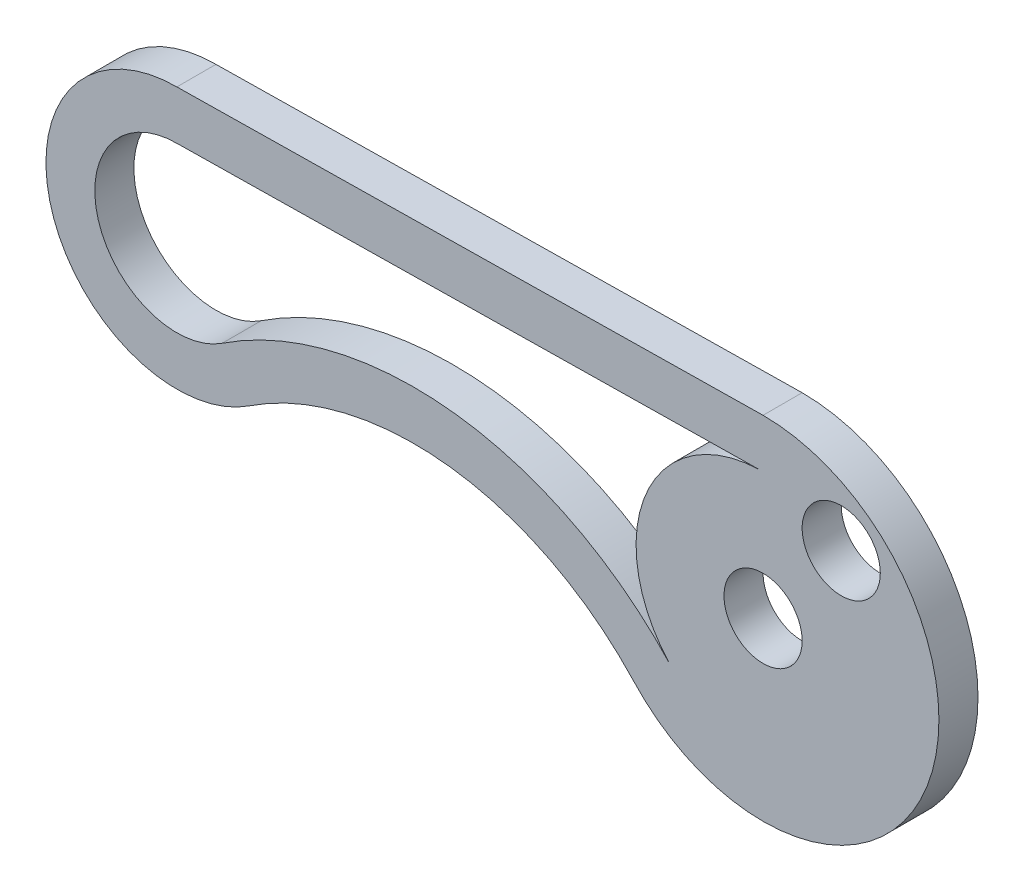
ISO-10303-21;
HEADER;
FILE_DESCRIPTION(('STEP AP214'),'2;1');
FILE_NAME('part.step','',(''),(''),'','','');
FILE_SCHEMA(('AUTOMOTIVE_DESIGN { 1 0 10303 214 1 1 1 1 }'));
ENDSEC;
DATA;
#1=APPLICATION_CONTEXT('core data for automotive mechanical design processes');
#2=APPLICATION_PROTOCOL_DEFINITION('international standard','automotive_design',2000,#1);
#3=PRODUCT_CONTEXT('',#1,'mechanical');
#4=PRODUCT('Part','Part','',(#3));
#5=PRODUCT_RELATED_PRODUCT_CATEGORY('part','',(#4));
#6=PRODUCT_DEFINITION_FORMATION('','',#4);
#7=PRODUCT_DEFINITION_CONTEXT('part definition',#1,'design');
#8=PRODUCT_DEFINITION('design','',#6,#7);
#9=PRODUCT_DEFINITION_SHAPE('','',#8);
#10=(LENGTH_UNIT() NAMED_UNIT(*) SI_UNIT(.MILLI.,.METRE.));
#11=(NAMED_UNIT(*) PLANE_ANGLE_UNIT() SI_UNIT($,.RADIAN.));
#12=(NAMED_UNIT(*) SI_UNIT($,.STERADIAN.) SOLID_ANGLE_UNIT());
#13=UNCERTAINTY_MEASURE_WITH_UNIT(LENGTH_MEASURE(1.E-05),#10,'distance_accuracy_value','');
#14=(GEOMETRIC_REPRESENTATION_CONTEXT(3) GLOBAL_UNCERTAINTY_ASSIGNED_CONTEXT((#13)) GLOBAL_UNIT_ASSIGNED_CONTEXT((#10,
#11,#12)) REPRESENTATION_CONTEXT('',''));
#15=CARTESIAN_POINT('',(0.,0.,0.));
#16=DIRECTION('',(0.,0.,1.));
#17=DIRECTION('',(1.,0.,0.));
#18=AXIS2_PLACEMENT_3D('',#15,#16,#17);
#19=CARTESIAN_POINT('',(-0.101114425405889,6.78911782241538,2.));
#20=DIRECTION('',(-0.0148919514058762,0.999889108743227,0.));
#21=DIRECTION('',(-0.999889108743227,-0.0148919514058762,0.));
#22=AXIS2_PLACEMENT_3D('',#19,#20,#21);
#23=PLANE('',#22);
#24=DIRECTION('',(0.999889108743227,0.0148919514058762,0.));
#25=VECTOR('',#24,1.);
#26=CARTESIAN_POINT('',(-0.101114425405889,6.78911782241538,0.));
#27=LINE('',#26,#25);
#28=CARTESIAN_POINT('',(-31.0042479387995,6.32885882114553,0.));
#29=VERTEX_POINT('',#28);
#30=CARTESIAN_POINT('',(-1.23137080255738,6.77228423267274,0.));
#31=VERTEX_POINT('',#30);
#32=EDGE_CURVE('E149',#29,#31,#27,.T.);
#33=ORIENTED_EDGE('',*,*,#32,.T.);
#34=DIRECTION('',(0.,0.,-1.));
#35=VECTOR('',#34,1.);
#36=CARTESIAN_POINT('',(-1.23137080255738,6.77228423267274,2.));
#37=LINE('',#36,#35);
#38=CARTESIAN_POINT('',(-1.23137080255738,6.77228423267274,2.));
#39=VERTEX_POINT('',#38);
#40=EDGE_CURVE('E11',#39,#31,#37,.T.);
#41=ORIENTED_EDGE('',*,*,#40,.F.);
#42=DIRECTION('',(0.999889108743227,0.0148919514058762,0.));
#43=VECTOR('',#42,1.);
#44=CARTESIAN_POINT('',(-0.101114425405889,6.78911782241538,2.));
#45=LINE('',#44,#43);
#46=CARTESIAN_POINT('',(-31.0042479387995,6.32885882114553,2.));
#47=VERTEX_POINT('',#46);
#48=EDGE_CURVE('E114',#47,#39,#45,.T.);
#49=ORIENTED_EDGE('',*,*,#48,.F.);
#50=DIRECTION('',(0.,0.,-1.));
#51=VECTOR('',#50,1.);
#52=CARTESIAN_POINT('',(-31.0042479387995,6.32885882114553,2.));
#53=LINE('',#52,#51);
#54=EDGE_CURVE('E54',#47,#29,#53,.T.);
#55=ORIENTED_EDGE('',*,*,#54,.T.);
#56=EDGE_LOOP('',(#33,#41,#49,#55));
#57=FACE_BOUND('',#56,.T.);
#58=ADVANCED_FACE('F35',(#57),#23,.F.);
#59=CARTESIAN_POINT('',(-1.02070029979408,0.275699134387217,2.));
#60=DIRECTION('',(0.,0.,-1.));
#61=DIRECTION('',(-1.,0.,0.));
#62=AXIS2_PLACEMENT_3D('',#59,#60,#61);
#63=CYLINDRICAL_SURFACE('',#62,6.5);
#64=CARTESIAN_POINT('',(-1.02070029979408,0.275699134387217,0.));
#65=DIRECTION('',(0.,0.,1.));
#66=DIRECTION('',(1.,0.,0.));
#67=AXIS2_PLACEMENT_3D('',#64,#65,#66);
#68=CIRCLE('',#67,6.5);
#69=CARTESIAN_POINT('',(-5.79554492373144,-4.13461364559297,0.));
#70=VERTEX_POINT('',#69);
#71=EDGE_CURVE('E120',#31,#70,#68,.T.);
#72=ORIENTED_EDGE('',*,*,#71,.T.);
#73=DIRECTION('',(0.,0.,-1.));
#74=VECTOR('',#73,1.);
#75=CARTESIAN_POINT('',(-5.79554492373144,-4.13461364559297,2.));
#76=LINE('',#75,#74);
#77=CARTESIAN_POINT('',(-5.79554492373144,-4.13461364559297,2.));
#78=VERTEX_POINT('',#77);
#79=EDGE_CURVE('E45',#78,#70,#76,.T.);
#80=ORIENTED_EDGE('',*,*,#79,.F.);
#81=CARTESIAN_POINT('',(-1.02070029979408,0.275699134387217,2.));
#82=DIRECTION('',(0.,0.,1.));
#83=DIRECTION('',(1.,0.,0.));
#84=AXIS2_PLACEMENT_3D('',#81,#82,#83);
#85=CIRCLE('',#84,6.5);
#86=EDGE_CURVE('E108',#39,#78,#85,.T.);
#87=ORIENTED_EDGE('',*,*,#86,.F.);
#88=ORIENTED_EDGE('',*,*,#40,.T.);
#89=EDGE_LOOP('',(#72,#80,#87,#88));
#90=FACE_BOUND('',#89,.T.);
#91=ADVANCED_FACE('F119',(#90),#63,.T.);
#92=CARTESIAN_POINT('',(-18.8712732785137,-16.2120855661541,2.));
#93=DIRECTION('',(0.,0.,-1.));
#94=DIRECTION('',(-1.,0.,0.));
#95=AXIS2_PLACEMENT_3D('',#92,#93,#94);
#96=CYLINDRICAL_SURFACE('',#95,17.8);
#97=CARTESIAN_POINT('',(-18.8712732785137,-16.2120855661541,0.));
#98=DIRECTION('',(0.,0.,1.));
#99=DIRECTION('',(1.,0.,0.));
#100=AXIS2_PLACEMENT_3D('',#97,#98,#99);
#101=CIRCLE('',#100,17.8);
#102=CARTESIAN_POINT('',(-28.7012642320951,-1.37256812613911,0.));
#103=VERTEX_POINT('',#102);
#104=EDGE_CURVE('E152',#70,#103,#101,.T.);
#105=ORIENTED_EDGE('',*,*,#104,.T.);
#106=DIRECTION('',(0.,0.,-1.));
#107=VECTOR('',#106,1.);
#108=CARTESIAN_POINT('',(-28.7012642320951,-1.37256812613911,2.));
#109=LINE('',#108,#107);
#110=CARTESIAN_POINT('',(-28.7012642320951,-1.37256812613911,2.));
#111=VERTEX_POINT('',#110);
#112=EDGE_CURVE('E81',#111,#103,#109,.T.);
#113=ORIENTED_EDGE('',*,*,#112,.F.);
#114=CARTESIAN_POINT('',(-18.8712732785137,-16.2120855661541,2.));
#115=DIRECTION('',(0.,0.,1.));
#116=DIRECTION('',(1.,0.,0.));
#117=AXIS2_PLACEMENT_3D('',#114,#115,#116);
#118=CIRCLE('',#117,17.8);
#119=EDGE_CURVE('E113',#78,#111,#118,.T.);
#120=ORIENTED_EDGE('',*,*,#119,.F.);
#121=ORIENTED_EDGE('',*,*,#79,.T.);
#122=EDGE_LOOP('',(#105,#113,#120,#121));
#123=FACE_BOUND('',#122,.T.);
#124=ADVANCED_FACE('F124',(#123),#96,.T.);
#125=CARTESIAN_POINT('',(-18.8712732785137,-16.2120855661541,2.));
#126=DIRECTION('',(0.,0.,-1.));
#127=DIRECTION('',(-1.,0.,0.));
#128=AXIS2_PLACEMENT_3D('',#125,#126,#127);
#129=CYLINDRICAL_SURFACE('',#128,15.3);
#130=CARTESIAN_POINT('',(-18.8712732785137,-16.2120855661541,0.));
#131=DIRECTION('',(0.,0.,1.));
#132=DIRECTION('',(1.,0.,0.));
#133=AXIS2_PLACEMENT_3D('',#130,#131,#132);
#134=CIRCLE('',#133,15.3);
#135=CARTESIAN_POINT('',(-7.63202362524581,-5.83088779173919,0.));
#136=VERTEX_POINT('',#135);
#137=CARTESIAN_POINT('',(-27.3206475251314,-3.45677001378166,0.));
#138=VERTEX_POINT('',#137);
#139=EDGE_CURVE('E131',#136,#138,#134,.T.);
#140=ORIENTED_EDGE('',*,*,#139,.F.);
#141=DIRECTION('',(0.,0.,-1.));
#142=VECTOR('',#141,1.);
#143=CARTESIAN_POINT('',(-7.63202362524581,-5.83088779173919,2.));
#144=LINE('',#143,#142);
#145=CARTESIAN_POINT('',(-7.63202362524581,-5.83088779173919,2.));
#146=VERTEX_POINT('',#145);
#147=EDGE_CURVE('E39',#146,#136,#144,.T.);
#148=ORIENTED_EDGE('',*,*,#147,.F.);
#149=CARTESIAN_POINT('',(-18.8712732785137,-16.2120855661541,2.));
#150=DIRECTION('',(0.,0.,1.));
#151=DIRECTION('',(1.,0.,0.));
#152=AXIS2_PLACEMENT_3D('',#149,#150,#151);
#153=CIRCLE('',#152,15.3);
#154=CARTESIAN_POINT('',(-27.3206475251314,-3.45677001378166,2.));
#155=VERTEX_POINT('',#154);
#156=EDGE_CURVE('E157',#146,#155,#153,.T.);
#157=ORIENTED_EDGE('',*,*,#156,.T.);
#158=DIRECTION('',(0.,0.,-1.));
#159=VECTOR('',#158,1.);
#160=CARTESIAN_POINT('',(-27.3206475251314,-3.45677001378166,2.));
#161=LINE('',#160,#159);
#162=EDGE_CURVE('E127',#155,#138,#161,.T.);
#163=ORIENTED_EDGE('',*,*,#162,.T.);
#164=EDGE_LOOP('',(#140,#148,#157,#163));
#165=FACE_BOUND('',#164,.T.);
#166=ADVANCED_FACE('F37',(#165),#129,.F.);
#167=CARTESIAN_POINT('',(-1.02070029979408,0.275699134387217,2.));
#168=DIRECTION('',(0.,0.,-1.));
#169=DIRECTION('',(-1.,0.,0.));
#170=AXIS2_PLACEMENT_3D('',#167,#168,#169);
#171=CYLINDRICAL_SURFACE('',#170,9.);
#172=CARTESIAN_POINT('',(-1.02070029979408,0.275699134387217,0.));
#173=DIRECTION('',(0.,0.,1.));
#174=DIRECTION('',(1.,0.,0.));
#175=AXIS2_PLACEMENT_3D('',#172,#173,#174);
#176=CIRCLE('',#175,9.);
#177=CARTESIAN_POINT('',(-1.02070029979408,9.27569913438722,0.));
#178=VERTEX_POINT('',#177);
#179=EDGE_CURVE('E134',#136,#178,#176,.T.);
#180=ORIENTED_EDGE('',*,*,#179,.T.);
#181=DIRECTION('',(0.,0.,-1.));
#182=VECTOR('',#181,1.);
#183=CARTESIAN_POINT('',(-1.02070029979408,9.27569913438722,2.));
#184=LINE('',#183,#182);
#185=CARTESIAN_POINT('',(-1.02070029979408,9.27569913438722,2.));
#186=VERTEX_POINT('',#185);
#187=EDGE_CURVE('E162',#186,#178,#184,.T.);
#188=ORIENTED_EDGE('',*,*,#187,.F.);
#189=CARTESIAN_POINT('',(-1.02070029979408,0.275699134387217,2.));
#190=DIRECTION('',(0.,0.,1.));
#191=DIRECTION('',(1.,0.,0.));
#192=AXIS2_PLACEMENT_3D('',#189,#190,#191);
#193=CIRCLE('',#192,9.);
#194=EDGE_CURVE('E170',#146,#186,#193,.T.);
#195=ORIENTED_EDGE('',*,*,#194,.F.);
#196=ORIENTED_EDGE('',*,*,#147,.T.);
#197=EDGE_LOOP('',(#180,#188,#195,#196));
#198=FACE_BOUND('',#197,.T.);
#199=ADVANCED_FACE('F169',(#198),#171,.T.);
#200=CARTESIAN_POINT('',(-0.138344303920579,9.28884059427345,2.));
#201=DIRECTION('',(-0.0148919514058761,0.999889108743227,0.));
#202=DIRECTION('',(-0.999889108743227,-0.0148919514058761,0.));
#203=AXIS2_PLACEMENT_3D('',#200,#201,#202);
#204=PLANE('',#203);
#205=DIRECTION('',(0.999889108743227,0.0148919514058761,0.));
#206=VECTOR('',#205,1.);
#207=CARTESIAN_POINT('',(-0.138344303920579,9.28884059427345,0.));
#208=LINE('',#207,#206);
#209=CARTESIAN_POINT('',(-31.0207002997941,8.82889104510038,0.));
#210=VERTEX_POINT('',#209);
#211=EDGE_CURVE('E137',#210,#178,#208,.T.);
#212=ORIENTED_EDGE('',*,*,#211,.F.);
#213=DIRECTION('',(0.,0.,-1.));
#214=VECTOR('',#213,1.);
#215=CARTESIAN_POINT('',(-31.0207002997941,8.82889104510038,2.));
#216=LINE('',#215,#214);
#217=CARTESIAN_POINT('',(-31.0207002997941,8.82889104510038,2.));
#218=VERTEX_POINT('',#217);
#219=EDGE_CURVE('E161',#218,#210,#216,.T.);
#220=ORIENTED_EDGE('',*,*,#219,.F.);
#221=DIRECTION('',(0.999889108743227,0.0148919514058761,0.));
#222=VECTOR('',#221,1.);
#223=CARTESIAN_POINT('',(-0.138344303920579,9.28884059427345,2.));
#224=LINE('',#223,#222);
#225=EDGE_CURVE('E182',#218,#186,#224,.T.);
#226=ORIENTED_EDGE('',*,*,#225,.T.);
#227=ORIENTED_EDGE('',*,*,#187,.T.);
#228=EDGE_LOOP('',(#212,#220,#226,#227));
#229=FACE_BOUND('',#228,.T.);
#230=ADVANCED_FACE('F180',(#229),#204,.T.);
#231=CARTESIAN_POINT('',(2.97929970020592,5.27569913438722,2.));
#232=DIRECTION('',(0.,0.,-1.));
#233=DIRECTION('',(-1.,0.,0.));
#234=AXIS2_PLACEMENT_3D('',#231,#232,#233);
#235=CYLINDRICAL_SURFACE('',#234,2.);
#236=CARTESIAN_POINT('',(2.97929970020592,5.27569913438722,2.));
#237=DIRECTION('',(0.,0.,1.));
#238=DIRECTION('',(1.,0.,0.));
#239=AXIS2_PLACEMENT_3D('',#236,#237,#238);
#240=CIRCLE('',#239,2.);
#241=CARTESIAN_POINT('',(4.97929970020592,5.27569913438722,2.));
#242=VERTEX_POINT('',#241);
#243=EDGE_CURVE('E194',#242,#242,#240,.T.);
#244=ORIENTED_EDGE('',*,*,#243,.T.);
#245=EDGE_LOOP('',(#244));
#246=FACE_BOUND('',#245,.T.);
#247=CARTESIAN_POINT('',(2.97929970020592,5.27569913438722,0.));
#248=DIRECTION('',(0.,0.,1.));
#249=DIRECTION('',(1.,0.,0.));
#250=AXIS2_PLACEMENT_3D('',#247,#248,#249);
#251=CIRCLE('',#250,2.);
#252=CARTESIAN_POINT('',(4.97929970020592,5.27569913438722,0.));
#253=VERTEX_POINT('',#252);
#254=EDGE_CURVE('E146',#253,#253,#251,.T.);
#255=ORIENTED_EDGE('',*,*,#254,.F.);
#256=EDGE_LOOP('',(#255));
#257=FACE_BOUND('',#256,.T.);
#258=ADVANCED_FACE('F198',(#246,#257),#235,.F.);
#259=CARTESIAN_POINT('',(-1.02070029979408,0.275699134387217,2.));
#260=DIRECTION('',(0.,0.,-1.));
#261=DIRECTION('',(-1.,0.,0.));
#262=AXIS2_PLACEMENT_3D('',#259,#260,#261);
#263=CYLINDRICAL_SURFACE('',#262,2.);
#264=CARTESIAN_POINT('',(-1.02070029979408,0.275699134387217,2.));
#265=DIRECTION('',(0.,0.,1.));
#266=DIRECTION('',(1.,0.,0.));
#267=AXIS2_PLACEMENT_3D('',#264,#265,#266);
#268=CIRCLE('',#267,2.);
#269=CARTESIAN_POINT('',(0.979299700205919,0.275699134387217,2.));
#270=VERTEX_POINT('',#269);
#271=EDGE_CURVE('E185',#270,#270,#268,.T.);
#272=ORIENTED_EDGE('',*,*,#271,.T.);
#273=EDGE_LOOP('',(#272));
#274=FACE_BOUND('',#273,.T.);
#275=CARTESIAN_POINT('',(-1.02070029979408,0.275699134387217,0.));
#276=DIRECTION('',(0.,0.,1.));
#277=DIRECTION('',(1.,0.,0.));
#278=AXIS2_PLACEMENT_3D('',#275,#276,#277);
#279=CIRCLE('',#278,2.);
#280=CARTESIAN_POINT('',(0.979299700205919,0.275699134387217,0.));
#281=VERTEX_POINT('',#280);
#282=EDGE_CURVE('E143',#281,#281,#279,.T.);
#283=ORIENTED_EDGE('',*,*,#282,.F.);
#284=EDGE_LOOP('',(#283));
#285=FACE_BOUND('',#284,.T.);
#286=ADVANCED_FACE('F220',(#274,#285),#263,.F.);
#287=CARTESIAN_POINT('',(-31.0207002997941,2.12889104510037,2.));
#288=DIRECTION('',(0.,0.,-1.));
#289=DIRECTION('',(-1.,0.,0.));
#290=AXIS2_PLACEMENT_3D('',#287,#288,#289);
#291=CYLINDRICAL_SURFACE('',#290,6.7);
#292=CARTESIAN_POINT('',(-31.0207002997941,2.12889104510037,0.));
#293=DIRECTION('',(0.,0.,1.));
#294=DIRECTION('',(1.,0.,0.));
#295=AXIS2_PLACEMENT_3D('',#292,#293,#294);
#296=CIRCLE('',#295,6.7);
#297=EDGE_CURVE('E140',#210,#138,#296,.T.);
#298=ORIENTED_EDGE('',*,*,#297,.T.);
#299=ORIENTED_EDGE('',*,*,#162,.F.);
#300=CARTESIAN_POINT('',(-31.0207002997941,2.12889104510037,2.));
#301=DIRECTION('',(0.,0.,1.));
#302=DIRECTION('',(1.,0.,0.));
#303=AXIS2_PLACEMENT_3D('',#300,#301,#302);
#304=CIRCLE('',#303,6.7);
#305=EDGE_CURVE('E183',#218,#155,#304,.T.);
#306=ORIENTED_EDGE('',*,*,#305,.F.);
#307=ORIENTED_EDGE('',*,*,#219,.T.);
#308=EDGE_LOOP('',(#298,#299,#306,#307));
#309=FACE_BOUND('',#308,.T.);
#310=ADVANCED_FACE('F179',(#309),#291,.T.);
#311=CARTESIAN_POINT('',(-31.0207002997941,2.12889104510037,2.));
#312=DIRECTION('',(0.,0.,-1.));
#313=DIRECTION('',(-1.,0.,0.));
#314=AXIS2_PLACEMENT_3D('',#311,#312,#313);
#315=CYLINDRICAL_SURFACE('',#314,4.2);
#316=CARTESIAN_POINT('',(-31.0207002997941,2.12889104510037,0.));
#317=DIRECTION('',(0.,0.,1.));
#318=DIRECTION('',(1.,0.,0.));
#319=AXIS2_PLACEMENT_3D('',#316,#317,#318);
#320=CIRCLE('',#319,4.2);
#321=EDGE_CURVE('E154',#29,#103,#320,.T.);
#322=ORIENTED_EDGE('',*,*,#321,.F.);
#323=ORIENTED_EDGE('',*,*,#54,.F.);
#324=CARTESIAN_POINT('',(-31.0207002997941,2.12889104510037,2.));
#325=DIRECTION('',(0.,0.,1.));
#326=DIRECTION('',(1.,0.,0.));
#327=AXIS2_PLACEMENT_3D('',#324,#325,#326);
#328=CIRCLE('',#327,4.2);
#329=EDGE_CURVE('E125',#47,#111,#328,.T.);
#330=ORIENTED_EDGE('',*,*,#329,.T.);
#331=ORIENTED_EDGE('',*,*,#112,.T.);
#332=EDGE_LOOP('',(#322,#323,#330,#331));
#333=FACE_BOUND('',#332,.T.);
#334=ADVANCED_FACE('F202',(#333),#315,.F.);
#335=CARTESIAN_POINT('',(0.,0.,2.));
#336=DIRECTION('',(0.,0.,1.));
#337=DIRECTION('',(1.,0.,0.));
#338=AXIS2_PLACEMENT_3D('',#335,#336,#337);
#339=PLANE('',#338);
#340=ORIENTED_EDGE('',*,*,#156,.F.);
#341=ORIENTED_EDGE('',*,*,#194,.T.);
#342=ORIENTED_EDGE('',*,*,#225,.F.);
#343=ORIENTED_EDGE('',*,*,#305,.T.);
#344=EDGE_LOOP('',(#340,#341,#342,#343));
#345=FACE_BOUND('',#344,.T.);
#346=ORIENTED_EDGE('',*,*,#271,.F.);
#347=EDGE_LOOP('',(#346));
#348=FACE_BOUND('',#347,.T.);
#349=ORIENTED_EDGE('',*,*,#243,.F.);
#350=EDGE_LOOP('',(#349));
#351=FACE_BOUND('',#350,.T.);
#352=ORIENTED_EDGE('',*,*,#48,.T.);
#353=ORIENTED_EDGE('',*,*,#86,.T.);
#354=ORIENTED_EDGE('',*,*,#119,.T.);
#355=ORIENTED_EDGE('',*,*,#329,.F.);
#356=EDGE_LOOP('',(#352,#353,#354,#355));
#357=FACE_BOUND('',#356,.T.);
#358=ADVANCED_FACE('F110',(#345,#348,#351,#357),#339,.T.);
#359=CARTESIAN_POINT('',(0.,0.,0.));
#360=DIRECTION('',(0.,0.,1.));
#361=DIRECTION('',(1.,0.,0.));
#362=AXIS2_PLACEMENT_3D('',#359,#360,#361);
#363=PLANE('',#362);
#364=ORIENTED_EDGE('',*,*,#139,.T.);
#365=ORIENTED_EDGE('',*,*,#297,.F.);
#366=ORIENTED_EDGE('',*,*,#211,.T.);
#367=ORIENTED_EDGE('',*,*,#179,.F.);
#368=EDGE_LOOP('',(#364,#365,#366,#367));
#369=FACE_BOUND('',#368,.T.);
#370=ORIENTED_EDGE('',*,*,#282,.T.);
#371=EDGE_LOOP('',(#370));
#372=FACE_BOUND('',#371,.T.);
#373=ORIENTED_EDGE('',*,*,#254,.T.);
#374=EDGE_LOOP('',(#373));
#375=FACE_BOUND('',#374,.T.);
#376=ORIENTED_EDGE('',*,*,#32,.F.);
#377=ORIENTED_EDGE('',*,*,#321,.T.);
#378=ORIENTED_EDGE('',*,*,#104,.F.);
#379=ORIENTED_EDGE('',*,*,#71,.F.);
#380=EDGE_LOOP('',(#376,#377,#378,#379));
#381=FACE_BOUND('',#380,.T.);
#382=ADVANCED_FACE('F173',(#369,#372,#375,#381),#363,.F.);
#383=CLOSED_SHELL('',(#58,#91,#124,#166,#199,#230,#258,#286,#310,#334,#358,#382));
#384=MANIFOLD_SOLID_BREP('B2',#383);
#385=ADVANCED_BREP_SHAPE_REPRESENTATION('',(#18,#384),#14);
#386=SHAPE_DEFINITION_REPRESENTATION(#9,#385);
ENDSEC;
END-ISO-10303-21;
